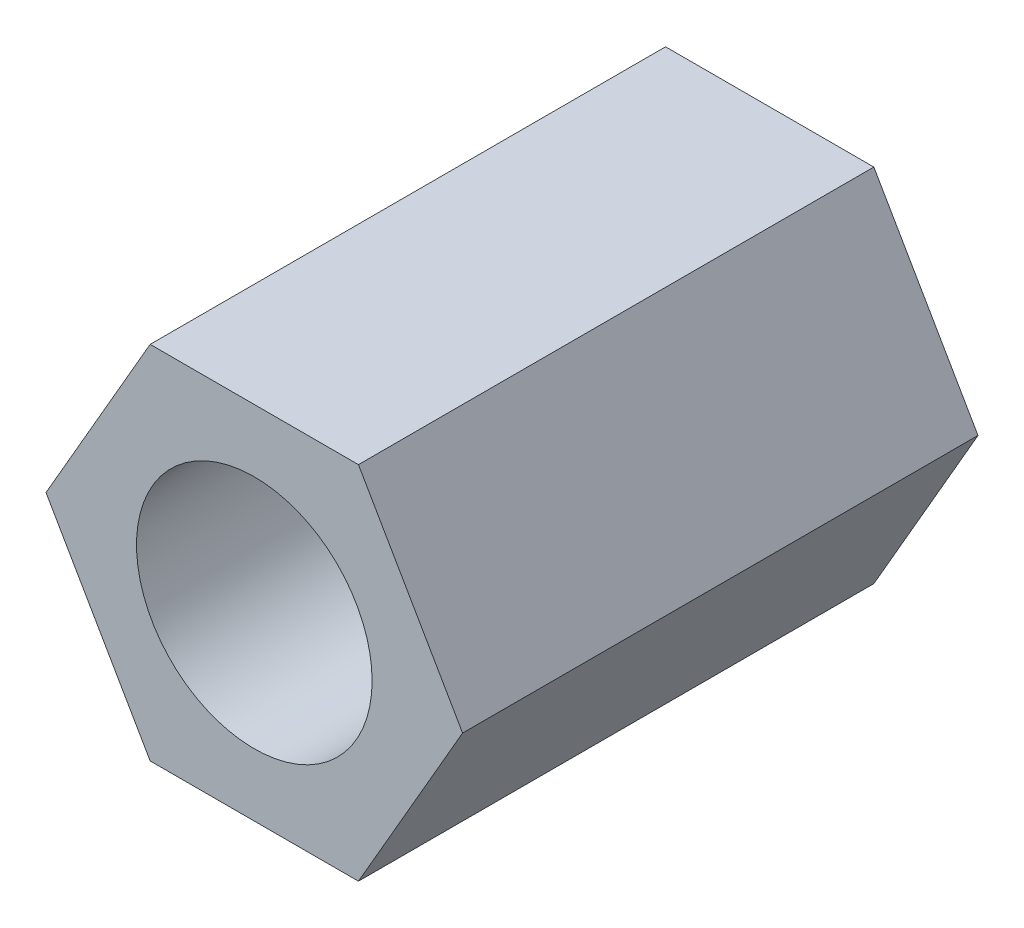
ISO-10303-21;
HEADER;
FILE_DESCRIPTION(('STEP AP214'),'2;1');
FILE_NAME('part.step','',(''),(''),'','','');
FILE_SCHEMA(('AUTOMOTIVE_DESIGN { 1 0 10303 214 1 1 1 1 }'));
ENDSEC;
DATA;
#1=APPLICATION_CONTEXT('core data for automotive mechanical design processes');
#2=APPLICATION_PROTOCOL_DEFINITION('international standard','automotive_design',2000,#1);
#3=PRODUCT_CONTEXT('',#1,'mechanical');
#4=PRODUCT('Part','Part','',(#3));
#5=PRODUCT_RELATED_PRODUCT_CATEGORY('part','',(#4));
#6=PRODUCT_DEFINITION_FORMATION('','',#4);
#7=PRODUCT_DEFINITION_CONTEXT('part definition',#1,'design');
#8=PRODUCT_DEFINITION('design','',#6,#7);
#9=PRODUCT_DEFINITION_SHAPE('','',#8);
#10=(LENGTH_UNIT() NAMED_UNIT(*) SI_UNIT(.MILLI.,.METRE.));
#11=(NAMED_UNIT(*) PLANE_ANGLE_UNIT() SI_UNIT($,.RADIAN.));
#12=(NAMED_UNIT(*) SI_UNIT($,.STERADIAN.) SOLID_ANGLE_UNIT());
#13=UNCERTAINTY_MEASURE_WITH_UNIT(LENGTH_MEASURE(1.E-05),#10,'distance_accuracy_value','');
#14=(GEOMETRIC_REPRESENTATION_CONTEXT(3) GLOBAL_UNCERTAINTY_ASSIGNED_CONTEXT((#13)) GLOBAL_UNIT_ASSIGNED_CONTEXT((#10,
#11,#12)) REPRESENTATION_CONTEXT('',''));
#15=CARTESIAN_POINT('',(0.,0.,0.));
#16=DIRECTION('',(0.,0.,1.));
#17=DIRECTION('',(1.,0.,0.));
#18=AXIS2_PLACEMENT_3D('',#15,#16,#17);
#19=CARTESIAN_POINT('',(0.,0.,7.));
#20=DIRECTION('',(0.,0.,1.));
#21=DIRECTION('',(1.,0.,0.));
#22=AXIS2_PLACEMENT_3D('',#19,#20,#21);
#23=PLANE('',#22);
#24=DIRECTION('',(0.5,0.866025403784439,0.));
#25=VECTOR('',#24,1.);
#26=CARTESIAN_POINT('',(1.41450815951458,-2.45,7.));
#27=LINE('',#26,#25);
#28=CARTESIAN_POINT('',(1.41450815951458,-2.45,7.));
#29=VERTEX_POINT('',#28);
#30=CARTESIAN_POINT('',(2.82901631902917,0.,7.));
#31=VERTEX_POINT('',#30);
#32=EDGE_CURVE('E129',#29,#31,#27,.T.);
#33=ORIENTED_EDGE('',*,*,#32,.T.);
#34=DIRECTION('',(-0.5,0.866025403784439,0.));
#35=VECTOR('',#34,1.);
#36=CARTESIAN_POINT('',(2.82901631902917,0.,7.));
#37=LINE('',#36,#35);
#38=CARTESIAN_POINT('',(1.41450815951458,2.45,7.));
#39=VERTEX_POINT('',#38);
#40=EDGE_CURVE('E87',#31,#39,#37,.T.);
#41=ORIENTED_EDGE('',*,*,#40,.T.);
#42=DIRECTION('',(-1.,0.,0.));
#43=VECTOR('',#42,1.);
#44=CARTESIAN_POINT('',(1.41450815951458,2.45,7.));
#45=LINE('',#44,#43);
#46=CARTESIAN_POINT('',(-1.41450815951458,2.45,7.));
#47=VERTEX_POINT('',#46);
#48=EDGE_CURVE('E100',#39,#47,#45,.T.);
#49=ORIENTED_EDGE('',*,*,#48,.T.);
#50=DIRECTION('',(-0.5,-0.866025403784439,0.));
#51=VECTOR('',#50,1.);
#52=CARTESIAN_POINT('',(-1.41450815951458,2.45,7.));
#53=LINE('',#52,#51);
#54=CARTESIAN_POINT('',(-2.82901631902917,0.,7.));
#55=VERTEX_POINT('',#54);
#56=EDGE_CURVE('E94',#47,#55,#53,.T.);
#57=ORIENTED_EDGE('',*,*,#56,.T.);
#58=DIRECTION('',(0.5,-0.866025403784439,0.));
#59=VECTOR('',#58,1.);
#60=CARTESIAN_POINT('',(-2.82901631902917,0.,7.));
#61=LINE('',#60,#59);
#62=CARTESIAN_POINT('',(-1.41450815951458,-2.45,7.));
#63=VERTEX_POINT('',#62);
#64=EDGE_CURVE('E98',#55,#63,#61,.T.);
#65=ORIENTED_EDGE('',*,*,#64,.T.);
#66=DIRECTION('',(1.,0.,0.));
#67=VECTOR('',#66,1.);
#68=CARTESIAN_POINT('',(-1.41450815951458,-2.45,7.));
#69=LINE('',#68,#67);
#70=EDGE_CURVE('E50',#63,#29,#69,.T.);
#71=ORIENTED_EDGE('',*,*,#70,.T.);
#72=EDGE_LOOP('',(#33,#41,#49,#57,#65,#71));
#73=FACE_BOUND('',#72,.T.);
#74=CARTESIAN_POINT('',(0.,0.,7.));
#75=DIRECTION('',(0.,0.,1.));
#76=DIRECTION('',(1.,0.,0.));
#77=AXIS2_PLACEMENT_3D('',#74,#75,#76);
#78=CIRCLE('',#77,1.6);
#79=CARTESIAN_POINT('',(1.6,0.,7.));
#80=VERTEX_POINT('',#79);
#81=EDGE_CURVE('E122',#80,#80,#78,.T.);
#82=ORIENTED_EDGE('',*,*,#81,.F.);
#83=EDGE_LOOP('',(#82));
#84=FACE_BOUND('',#83,.T.);
#85=ADVANCED_FACE('F33',(#73,#84),#23,.T.);
#86=CARTESIAN_POINT('',(0.,0.,0.));
#87=DIRECTION('',(0.,0.,1.));
#88=DIRECTION('',(1.,0.,0.));
#89=AXIS2_PLACEMENT_3D('',#86,#87,#88);
#90=PLANE('',#89);
#91=DIRECTION('',(0.5,0.866025403784439,0.));
#92=VECTOR('',#91,1.);
#93=CARTESIAN_POINT('',(1.41450815951458,-2.45,0.));
#94=LINE('',#93,#92);
#95=CARTESIAN_POINT('',(1.41450815951458,-2.45,0.));
#96=VERTEX_POINT('',#95);
#97=CARTESIAN_POINT('',(2.82901631902917,0.,0.));
#98=VERTEX_POINT('',#97);
#99=EDGE_CURVE('E118',#96,#98,#94,.T.);
#100=ORIENTED_EDGE('',*,*,#99,.F.);
#101=DIRECTION('',(1.,0.,0.));
#102=VECTOR('',#101,1.);
#103=CARTESIAN_POINT('',(-1.41450815951458,-2.45,0.));
#104=LINE('',#103,#102);
#105=CARTESIAN_POINT('',(-1.41450815951458,-2.45,0.));
#106=VERTEX_POINT('',#105);
#107=EDGE_CURVE('E79',#106,#96,#104,.T.);
#108=ORIENTED_EDGE('',*,*,#107,.F.);
#109=DIRECTION('',(0.5,-0.866025403784439,0.));
#110=VECTOR('',#109,1.);
#111=CARTESIAN_POINT('',(-2.82901631902917,0.,0.));
#112=LINE('',#111,#110);
#113=CARTESIAN_POINT('',(-2.82901631902917,0.,0.));
#114=VERTEX_POINT('',#113);
#115=EDGE_CURVE('E73',#114,#106,#112,.T.);
#116=ORIENTED_EDGE('',*,*,#115,.F.);
#117=DIRECTION('',(-0.5,-0.866025403784439,0.));
#118=VECTOR('',#117,1.);
#119=CARTESIAN_POINT('',(-1.41450815951458,2.45,0.));
#120=LINE('',#119,#118);
#121=CARTESIAN_POINT('',(-1.41450815951458,2.45,0.));
#122=VERTEX_POINT('',#121);
#123=EDGE_CURVE('E108',#122,#114,#120,.T.);
#124=ORIENTED_EDGE('',*,*,#123,.F.);
#125=DIRECTION('',(-1.,0.,0.));
#126=VECTOR('',#125,1.);
#127=CARTESIAN_POINT('',(1.41450815951458,2.45,0.));
#128=LINE('',#127,#126);
#129=CARTESIAN_POINT('',(1.41450815951458,2.45,0.));
#130=VERTEX_POINT('',#129);
#131=EDGE_CURVE('E124',#130,#122,#128,.T.);
#132=ORIENTED_EDGE('',*,*,#131,.F.);
#133=DIRECTION('',(-0.5,0.866025403784439,0.));
#134=VECTOR('',#133,1.);
#135=CARTESIAN_POINT('',(2.82901631902917,0.,0.));
#136=LINE('',#135,#134);
#137=EDGE_CURVE('E121',#98,#130,#136,.T.);
#138=ORIENTED_EDGE('',*,*,#137,.F.);
#139=EDGE_LOOP('',(#100,#108,#116,#124,#132,#138));
#140=FACE_BOUND('',#139,.T.);
#141=CARTESIAN_POINT('',(0.,0.,0.));
#142=DIRECTION('',(0.,0.,1.));
#143=DIRECTION('',(1.,0.,0.));
#144=AXIS2_PLACEMENT_3D('',#141,#142,#143);
#145=CIRCLE('',#144,1.6);
#146=CARTESIAN_POINT('',(1.6,0.,0.));
#147=VERTEX_POINT('',#146);
#148=EDGE_CURVE('E222',#147,#147,#145,.T.);
#149=ORIENTED_EDGE('',*,*,#148,.T.);
#150=EDGE_LOOP('',(#149));
#151=FACE_BOUND('',#150,.T.);
#152=ADVANCED_FACE('F138',(#140,#151),#90,.F.);
#153=CARTESIAN_POINT('',(1.41450815951458,-2.45,7.));
#154=DIRECTION('',(-0.866025403784439,0.5,0.));
#155=DIRECTION('',(-0.5,-0.866025403784439,0.));
#156=AXIS2_PLACEMENT_3D('',#153,#154,#155);
#157=PLANE('',#156);
#158=ORIENTED_EDGE('',*,*,#99,.T.);
#159=DIRECTION('',(0.,0.,-1.));
#160=VECTOR('',#159,1.);
#161=CARTESIAN_POINT('',(2.82901631902917,0.,7.));
#162=LINE('',#161,#160);
#163=EDGE_CURVE('E11',#31,#98,#162,.T.);
#164=ORIENTED_EDGE('',*,*,#163,.F.);
#165=ORIENTED_EDGE('',*,*,#32,.F.);
#166=DIRECTION('',(0.,0.,-1.));
#167=VECTOR('',#166,1.);
#168=CARTESIAN_POINT('',(1.41450815951458,-2.45,7.));
#169=LINE('',#168,#167);
#170=EDGE_CURVE('E114',#29,#96,#169,.T.);
#171=ORIENTED_EDGE('',*,*,#170,.T.);
#172=EDGE_LOOP('',(#158,#164,#165,#171));
#173=FACE_BOUND('',#172,.T.);
#174=ADVANCED_FACE('F35',(#173),#157,.F.);
#175=CARTESIAN_POINT('',(2.82901631902917,0.,7.));
#176=DIRECTION('',(-0.866025403784438,-0.5,0.));
#177=DIRECTION('',(0.5,-0.866025403784439,0.));
#178=AXIS2_PLACEMENT_3D('',#175,#176,#177);
#179=PLANE('',#178);
#180=ORIENTED_EDGE('',*,*,#137,.T.);
#181=DIRECTION('',(0.,0.,-1.));
#182=VECTOR('',#181,1.);
#183=CARTESIAN_POINT('',(1.41450815951458,2.45,7.));
#184=LINE('',#183,#182);
#185=EDGE_CURVE('E42',#39,#130,#184,.T.);
#186=ORIENTED_EDGE('',*,*,#185,.F.);
#187=ORIENTED_EDGE('',*,*,#40,.F.);
#188=ORIENTED_EDGE('',*,*,#163,.T.);
#189=EDGE_LOOP('',(#180,#186,#187,#188));
#190=FACE_BOUND('',#189,.T.);
#191=ADVANCED_FACE('F163',(#190),#179,.F.);
#192=CARTESIAN_POINT('',(1.41450815951458,2.45,7.));
#193=DIRECTION('',(0.,-1.,0.));
#194=DIRECTION('',(0.,0.,-1.));
#195=AXIS2_PLACEMENT_3D('',#192,#193,#194);
#196=PLANE('',#195);
#197=ORIENTED_EDGE('',*,*,#131,.T.);
#198=DIRECTION('',(0.,0.,-1.));
#199=VECTOR('',#198,1.);
#200=CARTESIAN_POINT('',(-1.41450815951458,2.45,7.));
#201=LINE('',#200,#199);
#202=EDGE_CURVE('E109',#47,#122,#201,.T.);
#203=ORIENTED_EDGE('',*,*,#202,.F.);
#204=ORIENTED_EDGE('',*,*,#48,.F.);
#205=ORIENTED_EDGE('',*,*,#185,.T.);
#206=EDGE_LOOP('',(#197,#203,#204,#205));
#207=FACE_BOUND('',#206,.T.);
#208=ADVANCED_FACE('F135',(#207),#196,.F.);
#209=CARTESIAN_POINT('',(-1.41450815951458,2.45,7.));
#210=DIRECTION('',(0.866025403784439,-0.5,0.));
#211=DIRECTION('',(0.5,0.866025403784439,0.));
#212=AXIS2_PLACEMENT_3D('',#209,#210,#211);
#213=PLANE('',#212);
#214=ORIENTED_EDGE('',*,*,#123,.T.);
#215=DIRECTION('',(0.,0.,-1.));
#216=VECTOR('',#215,1.);
#217=CARTESIAN_POINT('',(-2.82901631902917,0.,7.));
#218=LINE('',#217,#216);
#219=EDGE_CURVE('E105',#55,#114,#218,.T.);
#220=ORIENTED_EDGE('',*,*,#219,.F.);
#221=ORIENTED_EDGE('',*,*,#56,.F.);
#222=ORIENTED_EDGE('',*,*,#202,.T.);
#223=EDGE_LOOP('',(#214,#220,#221,#222));
#224=FACE_BOUND('',#223,.T.);
#225=ADVANCED_FACE('F106',(#224),#213,.F.);
#226=CARTESIAN_POINT('',(-2.82901631902917,0.,7.));
#227=DIRECTION('',(0.866025403784438,0.5,0.));
#228=DIRECTION('',(-0.5,0.866025403784438,0.));
#229=AXIS2_PLACEMENT_3D('',#226,#227,#228);
#230=PLANE('',#229);
#231=ORIENTED_EDGE('',*,*,#115,.T.);
#232=DIRECTION('',(0.,0.,-1.));
#233=VECTOR('',#232,1.);
#234=CARTESIAN_POINT('',(-1.41450815951458,-2.45,7.));
#235=LINE('',#234,#233);
#236=EDGE_CURVE('E110',#63,#106,#235,.T.);
#237=ORIENTED_EDGE('',*,*,#236,.F.);
#238=ORIENTED_EDGE('',*,*,#64,.F.);
#239=ORIENTED_EDGE('',*,*,#219,.T.);
#240=EDGE_LOOP('',(#231,#237,#238,#239));
#241=FACE_BOUND('',#240,.T.);
#242=ADVANCED_FACE('F112',(#241),#230,.F.);
#243=CARTESIAN_POINT('',(-1.41450815951458,-2.45,7.));
#244=DIRECTION('',(0.,1.,0.));
#245=DIRECTION('',(0.,0.,1.));
#246=AXIS2_PLACEMENT_3D('',#243,#244,#245);
#247=PLANE('',#246);
#248=ORIENTED_EDGE('',*,*,#107,.T.);
#249=ORIENTED_EDGE('',*,*,#170,.F.);
#250=ORIENTED_EDGE('',*,*,#70,.F.);
#251=ORIENTED_EDGE('',*,*,#236,.T.);
#252=EDGE_LOOP('',(#248,#249,#250,#251));
#253=FACE_BOUND('',#252,.T.);
#254=ADVANCED_FACE('F143',(#253),#247,.F.);
#255=CARTESIAN_POINT('',(0.,0.,7.));
#256=DIRECTION('',(0.,0.,-1.));
#257=DIRECTION('',(-1.,0.,0.));
#258=AXIS2_PLACEMENT_3D('',#255,#256,#257);
#259=CYLINDRICAL_SURFACE('',#258,1.6);
#260=ORIENTED_EDGE('',*,*,#81,.T.);
#261=EDGE_LOOP('',(#260));
#262=FACE_BOUND('',#261,.T.);
#263=ORIENTED_EDGE('',*,*,#148,.F.);
#264=EDGE_LOOP('',(#263));
#265=FACE_BOUND('',#264,.T.);
#266=ADVANCED_FACE('F145',(#262,#265),#259,.F.);
#267=CLOSED_SHELL('',(#85,#152,#174,#191,#208,#225,#242,#254,#266));
#268=MANIFOLD_SOLID_BREP('B2',#267);
#269=ADVANCED_BREP_SHAPE_REPRESENTATION('',(#18,#268),#14);
#270=SHAPE_DEFINITION_REPRESENTATION(#9,#269);
ENDSEC;
END-ISO-10303-21;
